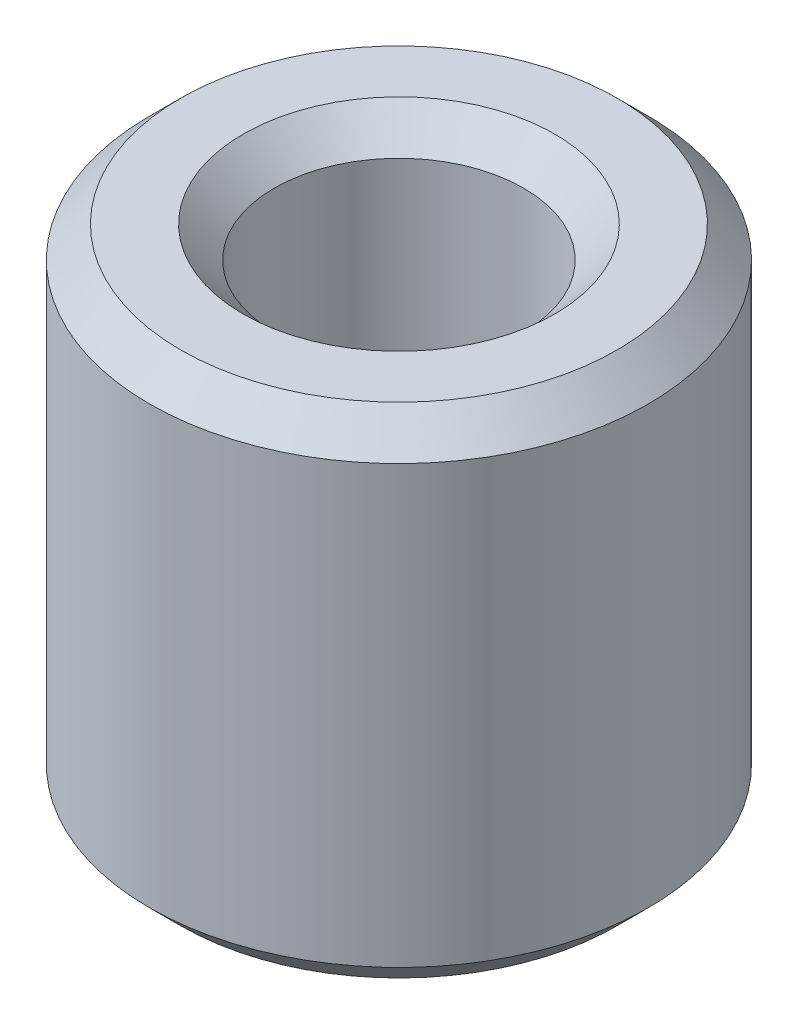
ISO-10303-21;
HEADER;
FILE_DESCRIPTION(('STEP AP214'),'2;1');
FILE_NAME('part.step','',(''),(''),'','','');
FILE_SCHEMA(('AUTOMOTIVE_DESIGN { 1 0 10303 214 1 1 1 1 }'));
ENDSEC;
DATA;
#1=APPLICATION_CONTEXT('core data for automotive mechanical design processes');
#2=APPLICATION_PROTOCOL_DEFINITION('international standard','automotive_design',2000,#1);
#3=PRODUCT_CONTEXT('',#1,'mechanical');
#4=PRODUCT('Part','Part','',(#3));
#5=PRODUCT_RELATED_PRODUCT_CATEGORY('part','',(#4));
#6=PRODUCT_DEFINITION_FORMATION('','',#4);
#7=PRODUCT_DEFINITION_CONTEXT('part definition',#1,'design');
#8=PRODUCT_DEFINITION('design','',#6,#7);
#9=PRODUCT_DEFINITION_SHAPE('','',#8);
#10=(LENGTH_UNIT() NAMED_UNIT(*) SI_UNIT(.MILLI.,.METRE.));
#11=(NAMED_UNIT(*) PLANE_ANGLE_UNIT() SI_UNIT($,.RADIAN.));
#12=(NAMED_UNIT(*) SI_UNIT($,.STERADIAN.) SOLID_ANGLE_UNIT());
#13=UNCERTAINTY_MEASURE_WITH_UNIT(LENGTH_MEASURE(1.E-05),#10,'distance_accuracy_value','');
#14=(GEOMETRIC_REPRESENTATION_CONTEXT(3) GLOBAL_UNCERTAINTY_ASSIGNED_CONTEXT((#13)) GLOBAL_UNIT_ASSIGNED_CONTEXT((#10,
#11,#12)) REPRESENTATION_CONTEXT('',''));
#15=CARTESIAN_POINT('',(0.,0.,0.));
#16=DIRECTION('',(0.,0.,1.));
#17=DIRECTION('',(1.,0.,0.));
#18=AXIS2_PLACEMENT_3D('',#15,#16,#17);
#19=CARTESIAN_POINT('',(0.,8.,0.));
#20=DIRECTION('',(0.,1.,0.));
#21=DIRECTION('',(0.,0.,1.));
#22=AXIS2_PLACEMENT_3D('',#19,#20,#21);
#23=PLANE('',#22);
#24=CARTESIAN_POINT('',(0.,8.,0.));
#25=DIRECTION('',(0.,1.,0.));
#26=DIRECTION('',(0.,0.,1.));
#27=AXIS2_PLACEMENT_3D('',#24,#25,#26);
#28=CIRCLE('',#27,2.5);
#29=CARTESIAN_POINT('',(0.,8.,2.5));
#30=VERTEX_POINT('',#29);
#31=EDGE_CURVE('E52',#30,#30,#28,.F.);
#32=ORIENTED_EDGE('',*,*,#31,.T.);
#33=EDGE_LOOP('',(#32));
#34=FACE_BOUND('',#33,.T.);
#35=CARTESIAN_POINT('',(0.,8.,0.));
#36=DIRECTION('',(0.,1.,0.));
#37=DIRECTION('',(0.,0.,1.));
#38=AXIS2_PLACEMENT_3D('',#35,#36,#37);
#39=CIRCLE('',#38,3.5);
#40=CARTESIAN_POINT('',(0.,8.,3.5));
#41=VERTEX_POINT('',#40);
#42=EDGE_CURVE('E55',#41,#41,#39,.T.);
#43=ORIENTED_EDGE('',*,*,#42,.T.);
#44=EDGE_LOOP('',(#43));
#45=FACE_BOUND('',#44,.T.);
#46=ADVANCED_FACE('F32',(#34,#45),#23,.T.);
#47=CARTESIAN_POINT('',(0.,0.,0.));
#48=DIRECTION('',(0.,1.,0.));
#49=DIRECTION('',(0.,0.,1.));
#50=AXIS2_PLACEMENT_3D('',#47,#48,#49);
#51=PLANE('',#50);
#52=CARTESIAN_POINT('',(0.,0.,0.));
#53=DIRECTION('',(0.,1.,0.));
#54=DIRECTION('',(0.,0.,1.));
#55=AXIS2_PLACEMENT_3D('',#52,#53,#54);
#56=CIRCLE('',#55,3.5);
#57=CARTESIAN_POINT('',(0.,0.,3.5));
#58=VERTEX_POINT('',#57);
#59=EDGE_CURVE('E10',#58,#58,#56,.F.);
#60=ORIENTED_EDGE('',*,*,#59,.T.);
#61=EDGE_LOOP('',(#60));
#62=FACE_BOUND('',#61,.T.);
#63=CARTESIAN_POINT('',(0.,0.,0.));
#64=DIRECTION('',(0.,1.,0.));
#65=DIRECTION('',(0.,0.,1.));
#66=AXIS2_PLACEMENT_3D('',#63,#64,#65);
#67=CIRCLE('',#66,2.5);
#68=CARTESIAN_POINT('',(0.,0.,2.5));
#69=VERTEX_POINT('',#68);
#70=EDGE_CURVE('E39',#69,#69,#67,.T.);
#71=ORIENTED_EDGE('',*,*,#70,.T.);
#72=EDGE_LOOP('',(#71));
#73=FACE_BOUND('',#72,.T.);
#74=ADVANCED_FACE('F76',(#62,#73),#51,.F.);
#75=CARTESIAN_POINT('',(0.,8.,0.));
#76=DIRECTION('',(0.,-1.,0.));
#77=DIRECTION('',(0.,0.,-1.));
#78=AXIS2_PLACEMENT_3D('',#75,#76,#77);
#79=CYLINDRICAL_SURFACE('',#78,4.);
#80=CARTESIAN_POINT('',(0.,7.5,0.));
#81=DIRECTION('',(0.,1.,0.));
#82=DIRECTION('',(0.,0.,1.));
#83=AXIS2_PLACEMENT_3D('',#80,#81,#82);
#84=CIRCLE('',#83,4.);
#85=CARTESIAN_POINT('',(0.,7.5,4.));
#86=VERTEX_POINT('',#85);
#87=EDGE_CURVE('E43',#86,#86,#84,.F.);
#88=ORIENTED_EDGE('',*,*,#87,.T.);
#89=EDGE_LOOP('',(#88));
#90=FACE_BOUND('',#89,.T.);
#91=CARTESIAN_POINT('',(0.,0.5,0.));
#92=DIRECTION('',(0.,1.,0.));
#93=DIRECTION('',(0.,0.,1.));
#94=AXIS2_PLACEMENT_3D('',#91,#92,#93);
#95=CIRCLE('',#94,4.);
#96=CARTESIAN_POINT('',(0.,0.5,4.));
#97=VERTEX_POINT('',#96);
#98=EDGE_CURVE('E47',#97,#97,#95,.T.);
#99=ORIENTED_EDGE('',*,*,#98,.T.);
#100=EDGE_LOOP('',(#99));
#101=FACE_BOUND('',#100,.T.);
#102=ADVANCED_FACE('F82',(#90,#101),#79,.T.);
#103=CARTESIAN_POINT('',(0.,8.,0.));
#104=DIRECTION('',(0.,-1.,0.));
#105=DIRECTION('',(0.,0.,-1.));
#106=AXIS2_PLACEMENT_3D('',#103,#104,#105);
#107=CYLINDRICAL_SURFACE('',#106,2.);
#108=CARTESIAN_POINT('',(0.,7.5,0.));
#109=DIRECTION('',(0.,1.,0.));
#110=DIRECTION('',(0.,0.,1.));
#111=AXIS2_PLACEMENT_3D('',#108,#109,#110);
#112=CIRCLE('',#111,2.);
#113=CARTESIAN_POINT('',(0.,7.5,2.));
#114=VERTEX_POINT('',#113);
#115=EDGE_CURVE('E58',#114,#114,#112,.T.);
#116=ORIENTED_EDGE('',*,*,#115,.T.);
#117=EDGE_LOOP('',(#116));
#118=FACE_BOUND('',#117,.T.);
#119=CARTESIAN_POINT('',(0.,0.500000000000001,0.));
#120=DIRECTION('',(0.,1.,0.));
#121=DIRECTION('',(0.,0.,1.));
#122=AXIS2_PLACEMENT_3D('',#119,#120,#121);
#123=CIRCLE('',#122,2.);
#124=CARTESIAN_POINT('',(0.,0.500000000000001,2.));
#125=VERTEX_POINT('',#124);
#126=EDGE_CURVE('E61',#125,#125,#123,.F.);
#127=ORIENTED_EDGE('',*,*,#126,.T.);
#128=EDGE_LOOP('',(#127));
#129=FACE_BOUND('',#128,.T.);
#130=ADVANCED_FACE('F65',(#118,#129),#107,.F.);
#131=CARTESIAN_POINT('',(0.,7.5,0.));
#132=DIRECTION('',(0.,1.,0.));
#133=DIRECTION('',(0.,0.,1.));
#134=AXIS2_PLACEMENT_3D('',#131,#132,#133);
#135=CONICAL_SURFACE('',#134,2.,0.785398163397448);
#136=ORIENTED_EDGE('',*,*,#31,.F.);
#137=EDGE_LOOP('',(#136));
#138=FACE_BOUND('',#137,.T.);
#139=ORIENTED_EDGE('',*,*,#115,.F.);
#140=EDGE_LOOP('',(#139));
#141=FACE_BOUND('',#140,.T.);
#142=ADVANCED_FACE('F90',(#138,#141),#135,.F.);
#143=CARTESIAN_POINT('',(0.,8.,0.));
#144=DIRECTION('',(0.,-1.,0.));
#145=DIRECTION('',(0.,0.,-1.));
#146=AXIS2_PLACEMENT_3D('',#143,#144,#145);
#147=CONICAL_SURFACE('',#146,3.5,0.785398163397445);
#148=ORIENTED_EDGE('',*,*,#87,.F.);
#149=EDGE_LOOP('',(#148));
#150=FACE_BOUND('',#149,.T.);
#151=ORIENTED_EDGE('',*,*,#42,.F.);
#152=EDGE_LOOP('',(#151));
#153=FACE_BOUND('',#152,.T.);
#154=ADVANCED_FACE('F73',(#150,#153),#147,.T.);
#155=CARTESIAN_POINT('',(0.,0.5,0.));
#156=DIRECTION('',(0.,1.,0.));
#157=DIRECTION('',(0.,0.,1.));
#158=AXIS2_PLACEMENT_3D('',#155,#156,#157);
#159=CONICAL_SURFACE('',#158,4.,0.785398163397451);
#160=ORIENTED_EDGE('',*,*,#59,.F.);
#161=EDGE_LOOP('',(#160));
#162=FACE_BOUND('',#161,.T.);
#163=ORIENTED_EDGE('',*,*,#98,.F.);
#164=EDGE_LOOP('',(#163));
#165=FACE_BOUND('',#164,.T.);
#166=ADVANCED_FACE('F69',(#162,#165),#159,.T.);
#167=CARTESIAN_POINT('',(0.,0.,0.));
#168=DIRECTION('',(0.,-1.,0.));
#169=DIRECTION('',(0.,0.,-1.));
#170=AXIS2_PLACEMENT_3D('',#167,#168,#169);
#171=CONICAL_SURFACE('',#170,2.5,0.785398163397446);
#172=ORIENTED_EDGE('',*,*,#126,.F.);
#173=EDGE_LOOP('',(#172));
#174=FACE_BOUND('',#173,.T.);
#175=ORIENTED_EDGE('',*,*,#70,.F.);
#176=EDGE_LOOP('',(#175));
#177=FACE_BOUND('',#176,.T.);
#178=ADVANCED_FACE('F34',(#174,#177),#171,.F.);
#179=CLOSED_SHELL('',(#46,#74,#102,#130,#142,#154,#166,#178));
#180=MANIFOLD_SOLID_BREP('B2',#179);
#181=ADVANCED_BREP_SHAPE_REPRESENTATION('',(#18,#180),#14);
#182=SHAPE_DEFINITION_REPRESENTATION(#9,#181);
ENDSEC;
END-ISO-10303-21;
